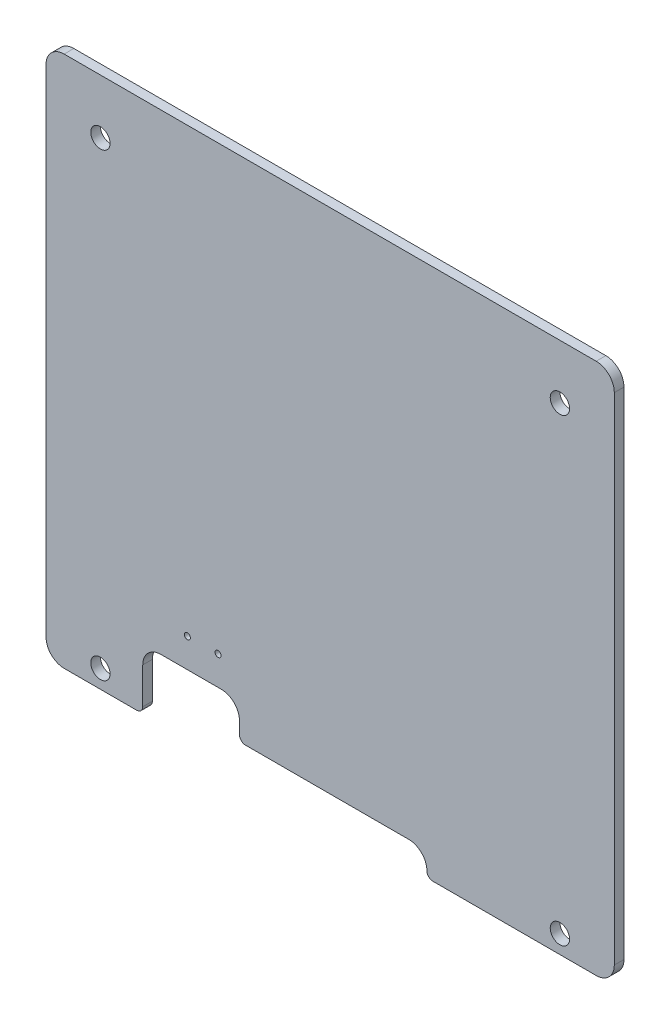
ISO-10303-21;
HEADER;
FILE_DESCRIPTION(('STEP AP214'),'2;1');
FILE_NAME('part.step','',(''),(''),'','','');
FILE_SCHEMA(('AUTOMOTIVE_DESIGN { 1 0 10303 214 1 1 1 1 }'));
ENDSEC;
DATA;
#1=APPLICATION_CONTEXT('core data for automotive mechanical design processes');
#2=APPLICATION_PROTOCOL_DEFINITION('international standard','automotive_design',2000,#1);
#3=PRODUCT_CONTEXT('',#1,'mechanical');
#4=PRODUCT('Part','Part','',(#3));
#5=PRODUCT_RELATED_PRODUCT_CATEGORY('part','',(#4));
#6=PRODUCT_DEFINITION_FORMATION('','',#4);
#7=PRODUCT_DEFINITION_CONTEXT('part definition',#1,'design');
#8=PRODUCT_DEFINITION('design','',#6,#7);
#9=PRODUCT_DEFINITION_SHAPE('','',#8);
#10=(LENGTH_UNIT() NAMED_UNIT(*) SI_UNIT(.MILLI.,.METRE.));
#11=(NAMED_UNIT(*) PLANE_ANGLE_UNIT() SI_UNIT($,.RADIAN.));
#12=(NAMED_UNIT(*) SI_UNIT($,.STERADIAN.) SOLID_ANGLE_UNIT());
#13=UNCERTAINTY_MEASURE_WITH_UNIT(LENGTH_MEASURE(1.E-05),#10,'distance_accuracy_value','');
#14=(GEOMETRIC_REPRESENTATION_CONTEXT(3) GLOBAL_UNCERTAINTY_ASSIGNED_CONTEXT((#13)) GLOBAL_UNIT_ASSIGNED_CONTEXT((#10,
#11,#12)) REPRESENTATION_CONTEXT('',''));
#15=CARTESIAN_POINT('',(0.,0.,0.));
#16=DIRECTION('',(0.,0.,1.));
#17=DIRECTION('',(1.,0.,0.));
#18=AXIS2_PLACEMENT_3D('',#15,#16,#17);
#19=CARTESIAN_POINT('',(-84.5653438799531,88.9518569300749,0.));
#20=DIRECTION('',(0.,0.,1.));
#21=DIRECTION('',(1.,0.,0.));
#22=AXIS2_PLACEMENT_3D('',#19,#20,#21);
#23=PLANE('',#22);
#24=CARTESIAN_POINT('',(-78.5653438799532,82.9518569300749,0.));
#25=DIRECTION('',(0.,0.,-1.));
#26=DIRECTION('',(-1.,0.,0.));
#27=AXIS2_PLACEMENT_3D('',#24,#25,#26);
#28=CIRCLE('',#27,1.59999999999999);
#29=CARTESIAN_POINT('',(-80.1653438799532,82.9518569300749,0.));
#30=VERTEX_POINT('',#29);
#31=EDGE_CURVE('E351',#30,#30,#28,.T.);
#32=ORIENTED_EDGE('',*,*,#31,.F.);
#33=EDGE_LOOP('',(#32));
#34=FACE_BOUND('',#33,.T.);
#35=CARTESIAN_POINT('',(-2.56534387995316,6.95185693007487,0.));
#36=DIRECTION('',(0.,0.,-1.));
#37=DIRECTION('',(-1.,0.,0.));
#38=AXIS2_PLACEMENT_3D('',#35,#36,#37);
#39=CIRCLE('',#38,1.59999999999999);
#40=CARTESIAN_POINT('',(-4.16534387995315,6.95185693007487,0.));
#41=VERTEX_POINT('',#40);
#42=EDGE_CURVE('E339',#41,#41,#39,.T.);
#43=ORIENTED_EDGE('',*,*,#42,.F.);
#44=EDGE_LOOP('',(#43));
#45=FACE_BOUND('',#44,.T.);
#46=CARTESIAN_POINT('',(-59.1053438799531,18.7518569300749,0.));
#47=DIRECTION('',(0.,0.,1.));
#48=DIRECTION('',(1.,0.,0.));
#49=AXIS2_PLACEMENT_3D('',#46,#47,#48);
#50=CIRCLE('',#49,0.500000000000006);
#51=CARTESIAN_POINT('',(-58.6053438799531,18.7518569300749,0.));
#52=VERTEX_POINT('',#51);
#53=EDGE_CURVE('E325',#52,#52,#50,.T.);
#54=ORIENTED_EDGE('',*,*,#53,.T.);
#55=EDGE_LOOP('',(#54));
#56=FACE_BOUND('',#55,.T.);
#57=DIRECTION('',(1.,0.,0.));
#58=VECTOR('',#57,1.);
#59=CARTESIAN_POINT('',(-55.5653438799532,7.9518569300749,0.));
#60=LINE('',#59,#58);
#61=CARTESIAN_POINT('',(-54.5653438799532,7.9518569300749,0.));
#62=VERTEX_POINT('',#61);
#63=CARTESIAN_POINT('',(-27.5653438799532,7.95185693007489,0.));
#64=VERTEX_POINT('',#63);
#65=EDGE_CURVE('E268',#62,#64,#60,.T.);
#66=ORIENTED_EDGE('',*,*,#65,.F.);
#67=CARTESIAN_POINT('',(-54.5653438799532,8.9518569300749,0.));
#68=DIRECTION('',(0.,0.,1.));
#69=DIRECTION('',(1.,0.,0.));
#70=AXIS2_PLACEMENT_3D('',#67,#68,#69);
#71=CIRCLE('',#70,1.);
#72=CARTESIAN_POINT('',(-55.5653438799532,8.9518569300749,0.));
#73=VERTEX_POINT('',#72);
#74=EDGE_CURVE('E231',#62,#73,#71,.F.);
#75=ORIENTED_EDGE('',*,*,#74,.T.);
#76=DIRECTION('',(0.,-1.,0.));
#77=VECTOR('',#76,1.);
#78=CARTESIAN_POINT('',(-55.5653438799532,7.9518569300749,0.));
#79=LINE('',#78,#77);
#80=CARTESIAN_POINT('',(-55.5653438799532,10.9518569300749,0.));
#81=VERTEX_POINT('',#80);
#82=EDGE_CURVE('E260',#81,#73,#79,.T.);
#83=ORIENTED_EDGE('',*,*,#82,.F.);
#84=CARTESIAN_POINT('',(-58.5653438799532,10.9518569300749,0.));
#85=DIRECTION('',(0.,0.,1.));
#86=DIRECTION('',(1.,0.,0.));
#87=AXIS2_PLACEMENT_3D('',#84,#85,#86);
#88=CIRCLE('',#87,3.);
#89=CARTESIAN_POINT('',(-58.5653438799532,13.9518569300749,0.));
#90=VERTEX_POINT('',#89);
#91=EDGE_CURVE('E215',#81,#90,#88,.T.);
#92=ORIENTED_EDGE('',*,*,#91,.T.);
#93=DIRECTION('',(1.,0.,0.));
#94=VECTOR('',#93,1.);
#95=CARTESIAN_POINT('',(-55.5653438799532,13.9518569300749,0.));
#96=LINE('',#95,#94);
#97=CARTESIAN_POINT('',(-68.5653438799531,13.9518569300749,0.));
#98=VERTEX_POINT('',#97);
#99=EDGE_CURVE('E256',#98,#90,#96,.T.);
#100=ORIENTED_EDGE('',*,*,#99,.F.);
#101=CARTESIAN_POINT('',(-68.5653438799531,10.9518569300749,0.));
#102=DIRECTION('',(0.,0.,1.));
#103=DIRECTION('',(1.,0.,0.));
#104=AXIS2_PLACEMENT_3D('',#101,#102,#103);
#105=CIRCLE('',#104,3.);
#106=CARTESIAN_POINT('',(-71.5653438799531,10.9518569300749,0.));
#107=VERTEX_POINT('',#106);
#108=EDGE_CURVE('E219',#98,#107,#105,.T.);
#109=ORIENTED_EDGE('',*,*,#108,.T.);
#110=DIRECTION('',(0.,1.,0.));
#111=VECTOR('',#110,1.);
#112=CARTESIAN_POINT('',(-71.5653438799531,13.9518569300749,0.));
#113=LINE('',#112,#111);
#114=CARTESIAN_POINT('',(-71.5653438799531,4.9518569300749,0.));
#115=VERTEX_POINT('',#114);
#116=EDGE_CURVE('E246',#115,#107,#113,.T.);
#117=ORIENTED_EDGE('',*,*,#116,.F.);
#118=CARTESIAN_POINT('',(-72.5653438799531,4.9518569300749,0.));
#119=DIRECTION('',(0.,0.,1.));
#120=DIRECTION('',(1.,0.,0.));
#121=AXIS2_PLACEMENT_3D('',#118,#119,#120);
#122=CIRCLE('',#121,1.);
#123=CARTESIAN_POINT('',(-72.5653438799531,3.9518569300749,0.));
#124=VERTEX_POINT('',#123);
#125=EDGE_CURVE('E227',#115,#124,#122,.F.);
#126=ORIENTED_EDGE('',*,*,#125,.T.);
#127=DIRECTION('',(1.,0.,0.));
#128=VECTOR('',#127,1.);
#129=CARTESIAN_POINT('',(-84.5653438799531,3.9518569300749,0.));
#130=LINE('',#129,#128);
#131=CARTESIAN_POINT('',(-84.5653438799531,3.9518569300749,0.));
#132=VERTEX_POINT('',#131);
#133=EDGE_CURVE('E257',#132,#124,#130,.T.);
#134=ORIENTED_EDGE('',*,*,#133,.F.);
#135=CARTESIAN_POINT('',(-84.5653438799531,6.9518569300749,0.));
#136=DIRECTION('',(0.,0.,1.));
#137=DIRECTION('',(-1.,0.,0.));
#138=AXIS2_PLACEMENT_3D('',#135,#136,#137);
#139=CIRCLE('',#138,3.);
#140=CARTESIAN_POINT('',(-87.5653438799531,6.95185693007492,0.));
#141=VERTEX_POINT('',#140);
#142=EDGE_CURVE('E262',#141,#132,#139,.T.);
#143=ORIENTED_EDGE('',*,*,#142,.F.);
#144=DIRECTION('',(0.,-1.,0.));
#145=VECTOR('',#144,1.);
#146=CARTESIAN_POINT('',(-87.5653438799531,88.9518569300748,0.));
#147=LINE('',#146,#145);
#148=CARTESIAN_POINT('',(-87.5653438799531,88.9518569300748,0.));
#149=VERTEX_POINT('',#148);
#150=EDGE_CURVE('E301',#149,#141,#147,.T.);
#151=ORIENTED_EDGE('',*,*,#150,.F.);
#152=CARTESIAN_POINT('',(-84.5653438799531,88.9518569300749,0.));
#153=DIRECTION('',(0.,0.,1.));
#154=DIRECTION('',(1.,0.,0.));
#155=AXIS2_PLACEMENT_3D('',#152,#153,#154);
#156=CIRCLE('',#155,3.);
#157=CARTESIAN_POINT('',(-84.5653438799531,91.9518569300749,0.));
#158=VERTEX_POINT('',#157);
#159=EDGE_CURVE('E187',#158,#149,#156,.T.);
#160=ORIENTED_EDGE('',*,*,#159,.F.);
#161=DIRECTION('',(-1.,0.,0.));
#162=VECTOR('',#161,1.);
#163=CARTESIAN_POINT('',(-84.5653438799531,91.9518569300749,0.));
#164=LINE('',#163,#162);
#165=CARTESIAN_POINT('',(3.43465612004681,91.9518569300749,0.));
#166=VERTEX_POINT('',#165);
#167=EDGE_CURVE('E183',#166,#158,#164,.T.);
#168=ORIENTED_EDGE('',*,*,#167,.F.);
#169=CARTESIAN_POINT('',(3.43465612004683,88.9518569300749,0.));
#170=DIRECTION('',(0.,0.,1.));
#171=DIRECTION('',(-1.,0.,0.));
#172=AXIS2_PLACEMENT_3D('',#169,#170,#171);
#173=CIRCLE('',#172,3.);
#174=CARTESIAN_POINT('',(6.43465612004683,88.9518569300748,0.));
#175=VERTEX_POINT('',#174);
#176=EDGE_CURVE('E276',#175,#166,#173,.T.);
#177=ORIENTED_EDGE('',*,*,#176,.F.);
#178=DIRECTION('',(0.,1.,0.));
#179=VECTOR('',#178,1.);
#180=CARTESIAN_POINT('',(6.43465612004683,88.9518569300748,0.));
#181=LINE('',#180,#179);
#182=CARTESIAN_POINT('',(6.43465612004684,6.9518569300749,0.));
#183=VERTEX_POINT('',#182);
#184=EDGE_CURVE('E274',#183,#175,#181,.T.);
#185=ORIENTED_EDGE('',*,*,#184,.F.);
#186=CARTESIAN_POINT('',(3.43465612004684,6.9518569300749,0.));
#187=DIRECTION('',(0.,0.,1.));
#188=DIRECTION('',(1.,0.,0.));
#189=AXIS2_PLACEMENT_3D('',#186,#187,#188);
#190=CIRCLE('',#189,3.);
#191=CARTESIAN_POINT('',(3.43465612004684,3.9518569300749,0.));
#192=VERTEX_POINT('',#191);
#193=EDGE_CURVE('E272',#192,#183,#190,.T.);
#194=ORIENTED_EDGE('',*,*,#193,.F.);
#195=DIRECTION('',(1.,0.,0.));
#196=VECTOR('',#195,1.);
#197=CARTESIAN_POINT('',(-24.5653438799532,3.95185693007489,0.));
#198=LINE('',#197,#196);
#199=CARTESIAN_POINT('',(-23.5653438799532,3.95185693007489,0.));
#200=VERTEX_POINT('',#199);
#201=EDGE_CURVE('E270',#200,#192,#198,.T.);
#202=ORIENTED_EDGE('',*,*,#201,.F.);
#203=CARTESIAN_POINT('',(-23.5653438799532,4.95185693007489,0.));
#204=DIRECTION('',(0.,0.,1.));
#205=DIRECTION('',(1.,0.,0.));
#206=AXIS2_PLACEMENT_3D('',#203,#204,#205);
#207=CIRCLE('',#206,1.);
#208=CARTESIAN_POINT('',(-24.5653438799532,4.95185693007489,0.));
#209=VERTEX_POINT('',#208);
#210=EDGE_CURVE('E229',#200,#209,#207,.F.);
#211=ORIENTED_EDGE('',*,*,#210,.T.);
#212=CARTESIAN_POINT('',(-27.5653438799532,4.95185693007489,0.));
#213=DIRECTION('',(0.,0.,1.));
#214=DIRECTION('',(1.,0.,0.));
#215=AXIS2_PLACEMENT_3D('',#212,#213,#214);
#216=CIRCLE('',#215,3.);
#217=EDGE_CURVE('E210',#209,#64,#216,.T.);
#218=ORIENTED_EDGE('',*,*,#217,.T.);
#219=EDGE_LOOP('',(#66,#75,#83,#92,#100,#109,#117,#126,#134,#143,#151,#160,#168,#177,#185,#194,
#202,#211,#218));
#220=FACE_BOUND('',#219,.T.);
#221=CARTESIAN_POINT('',(-64.1853438799531,18.7518569300749,0.));
#222=DIRECTION('',(0.,0.,1.));
#223=DIRECTION('',(1.,0.,0.));
#224=AXIS2_PLACEMENT_3D('',#221,#222,#223);
#225=CIRCLE('',#224,0.499999999999999);
#226=CARTESIAN_POINT('',(-63.6853438799531,18.7518569300749,0.));
#227=VERTEX_POINT('',#226);
#228=EDGE_CURVE('E331',#227,#227,#225,.T.);
#229=ORIENTED_EDGE('',*,*,#228,.T.);
#230=EDGE_LOOP('',(#229));
#231=FACE_BOUND('',#230,.T.);
#232=CARTESIAN_POINT('',(-2.56534387995318,82.9518569300749,0.));
#233=DIRECTION('',(0.,0.,-1.));
#234=DIRECTION('',(-1.,0.,0.));
#235=AXIS2_PLACEMENT_3D('',#232,#233,#234);
#236=CIRCLE('',#235,1.59999999999999);
#237=CARTESIAN_POINT('',(-4.16534387995317,82.9518569300749,0.));
#238=VERTEX_POINT('',#237);
#239=EDGE_CURVE('E345',#238,#238,#236,.T.);
#240=ORIENTED_EDGE('',*,*,#239,.F.);
#241=EDGE_LOOP('',(#240));
#242=FACE_BOUND('',#241,.T.);
#243=CARTESIAN_POINT('',(-78.5653438799531,6.95185693007482,0.));
#244=DIRECTION('',(0.,0.,-1.));
#245=DIRECTION('',(-1.,0.,0.));
#246=AXIS2_PLACEMENT_3D('',#243,#244,#245);
#247=CIRCLE('',#246,1.59999999999999);
#248=CARTESIAN_POINT('',(-80.1653438799531,6.95185693007482,0.));
#249=VERTEX_POINT('',#248);
#250=EDGE_CURVE('E357',#249,#249,#247,.T.);
#251=ORIENTED_EDGE('',*,*,#250,.F.);
#252=EDGE_LOOP('',(#251));
#253=FACE_BOUND('',#252,.T.);
#254=ADVANCED_FACE('F32',(#34,#45,#56,#220,#231,#242,#253),#23,.F.);
#255=CARTESIAN_POINT('',(-84.5653438799531,88.9518569300749,1.6));
#256=DIRECTION('',(0.,0.,1.));
#257=DIRECTION('',(1.,0.,0.));
#258=AXIS2_PLACEMENT_3D('',#255,#256,#257);
#259=PLANE('',#258);
#260=CARTESIAN_POINT('',(-78.5653438799531,6.95185693007482,1.6));
#261=DIRECTION('',(0.,0.,1.));
#262=DIRECTION('',(1.,0.,0.));
#263=AXIS2_PLACEMENT_3D('',#260,#261,#262);
#264=CIRCLE('',#263,1.6);
#265=CARTESIAN_POINT('',(-76.9653438799532,6.95185693007482,1.6));
#266=VERTEX_POINT('',#265);
#267=EDGE_CURVE('E354',#266,#266,#264,.T.);
#268=ORIENTED_EDGE('',*,*,#267,.F.);
#269=EDGE_LOOP('',(#268));
#270=FACE_BOUND('',#269,.T.);
#271=CARTESIAN_POINT('',(-78.5653438799532,82.9518569300749,1.6));
#272=DIRECTION('',(0.,0.,1.));
#273=DIRECTION('',(1.,0.,0.));
#274=AXIS2_PLACEMENT_3D('',#271,#272,#273);
#275=CIRCLE('',#274,1.6);
#276=CARTESIAN_POINT('',(-76.9653438799532,82.9518569300749,1.6));
#277=VERTEX_POINT('',#276);
#278=EDGE_CURVE('E348',#277,#277,#275,.T.);
#279=ORIENTED_EDGE('',*,*,#278,.F.);
#280=EDGE_LOOP('',(#279));
#281=FACE_BOUND('',#280,.T.);
#282=CARTESIAN_POINT('',(-2.56534387995318,82.9518569300749,1.6));
#283=DIRECTION('',(0.,0.,1.));
#284=DIRECTION('',(1.,0.,0.));
#285=AXIS2_PLACEMENT_3D('',#282,#283,#284);
#286=CIRCLE('',#285,1.59999999999999);
#287=CARTESIAN_POINT('',(-0.965343879953191,82.9518569300749,1.6));
#288=VERTEX_POINT('',#287);
#289=EDGE_CURVE('E342',#288,#288,#286,.T.);
#290=ORIENTED_EDGE('',*,*,#289,.F.);
#291=EDGE_LOOP('',(#290));
#292=FACE_BOUND('',#291,.T.);
#293=CARTESIAN_POINT('',(-2.56534387995316,6.95185693007487,1.6));
#294=DIRECTION('',(0.,0.,1.));
#295=DIRECTION('',(1.,0.,0.));
#296=AXIS2_PLACEMENT_3D('',#293,#294,#295);
#297=CIRCLE('',#296,1.59999999999999);
#298=CARTESIAN_POINT('',(-0.96534387995317,6.95185693007487,1.6));
#299=VERTEX_POINT('',#298);
#300=EDGE_CURVE('E334',#299,#299,#297,.T.);
#301=ORIENTED_EDGE('',*,*,#300,.F.);
#302=EDGE_LOOP('',(#301));
#303=FACE_BOUND('',#302,.T.);
#304=CARTESIAN_POINT('',(-59.1053438799531,18.7518569300749,1.6));
#305=DIRECTION('',(0.,0.,1.));
#306=DIRECTION('',(1.,0.,0.));
#307=AXIS2_PLACEMENT_3D('',#304,#305,#306);
#308=CIRCLE('',#307,0.500000000000006);
#309=CARTESIAN_POINT('',(-58.6053438799531,18.7518569300749,1.6));
#310=VERTEX_POINT('',#309);
#311=EDGE_CURVE('E305',#310,#310,#308,.T.);
#312=ORIENTED_EDGE('',*,*,#311,.F.);
#313=EDGE_LOOP('',(#312));
#314=FACE_BOUND('',#313,.T.);
#315=DIRECTION('',(0.,-1.,0.));
#316=VECTOR('',#315,1.);
#317=CARTESIAN_POINT('',(-55.5653438799532,7.9518569300749,1.6));
#318=LINE('',#317,#316);
#319=CARTESIAN_POINT('',(-55.5653438799532,10.9518569300749,1.6));
#320=VERTEX_POINT('',#319);
#321=CARTESIAN_POINT('',(-55.5653438799532,8.9518569300749,1.6));
#322=VERTEX_POINT('',#321);
#323=EDGE_CURVE('E317',#320,#322,#318,.T.);
#324=ORIENTED_EDGE('',*,*,#323,.T.);
#325=CARTESIAN_POINT('',(-54.5653438799532,8.9518569300749,1.6));
#326=DIRECTION('',(0.,0.,1.));
#327=DIRECTION('',(1.,0.,0.));
#328=AXIS2_PLACEMENT_3D('',#325,#326,#327);
#329=CIRCLE('',#328,1.);
#330=CARTESIAN_POINT('',(-54.5653438799532,7.9518569300749,1.6));
#331=VERTEX_POINT('',#330);
#332=EDGE_CURVE('E237',#322,#331,#329,.T.);
#333=ORIENTED_EDGE('',*,*,#332,.T.);
#334=DIRECTION('',(1.,0.,0.));
#335=VECTOR('',#334,1.);
#336=CARTESIAN_POINT('',(-55.5653438799532,7.9518569300749,1.6));
#337=LINE('',#336,#335);
#338=CARTESIAN_POINT('',(-27.5653438799532,7.95185693007489,1.6));
#339=VERTEX_POINT('',#338);
#340=EDGE_CURVE('E315',#331,#339,#337,.T.);
#341=ORIENTED_EDGE('',*,*,#340,.T.);
#342=CARTESIAN_POINT('',(-27.5653438799532,4.95185693007489,1.6));
#343=DIRECTION('',(0.,0.,1.));
#344=DIRECTION('',(1.,0.,0.));
#345=AXIS2_PLACEMENT_3D('',#342,#343,#344);
#346=CIRCLE('',#345,3.);
#347=CARTESIAN_POINT('',(-24.5653438799532,4.95185693007489,1.6));
#348=VERTEX_POINT('',#347);
#349=EDGE_CURVE('E213',#339,#348,#346,.F.);
#350=ORIENTED_EDGE('',*,*,#349,.T.);
#351=CARTESIAN_POINT('',(-23.5653438799532,4.95185693007489,1.6));
#352=DIRECTION('',(0.,0.,1.));
#353=DIRECTION('',(1.,0.,0.));
#354=AXIS2_PLACEMENT_3D('',#351,#352,#353);
#355=CIRCLE('',#354,1.);
#356=CARTESIAN_POINT('',(-23.5653438799532,3.95185693007489,1.6));
#357=VERTEX_POINT('',#356);
#358=EDGE_CURVE('E47',#348,#357,#355,.T.);
#359=ORIENTED_EDGE('',*,*,#358,.T.);
#360=DIRECTION('',(1.,0.,0.));
#361=VECTOR('',#360,1.);
#362=CARTESIAN_POINT('',(-24.5653438799532,3.95185693007489,1.6));
#363=LINE('',#362,#361);
#364=CARTESIAN_POINT('',(3.43465612004684,3.9518569300749,1.6));
#365=VERTEX_POINT('',#364);
#366=EDGE_CURVE('E313',#357,#365,#363,.T.);
#367=ORIENTED_EDGE('',*,*,#366,.T.);
#368=CARTESIAN_POINT('',(3.43465612004684,6.9518569300749,1.6));
#369=DIRECTION('',(0.,0.,1.));
#370=DIRECTION('',(1.,0.,0.));
#371=AXIS2_PLACEMENT_3D('',#368,#369,#370);
#372=CIRCLE('',#371,3.);
#373=CARTESIAN_POINT('',(6.43465612004684,6.9518569300749,1.6));
#374=VERTEX_POINT('',#373);
#375=EDGE_CURVE('E311',#365,#374,#372,.T.);
#376=ORIENTED_EDGE('',*,*,#375,.T.);
#377=DIRECTION('',(0.,1.,0.));
#378=VECTOR('',#377,1.);
#379=CARTESIAN_POINT('',(6.43465612004683,88.9518569300748,1.6));
#380=LINE('',#379,#378);
#381=CARTESIAN_POINT('',(6.43465612004683,88.9518569300748,1.6));
#382=VERTEX_POINT('',#381);
#383=EDGE_CURVE('E309',#374,#382,#380,.T.);
#384=ORIENTED_EDGE('',*,*,#383,.T.);
#385=CARTESIAN_POINT('',(3.43465612004683,88.9518569300749,1.6));
#386=DIRECTION('',(0.,0.,1.));
#387=DIRECTION('',(-1.,0.,0.));
#388=AXIS2_PLACEMENT_3D('',#385,#386,#387);
#389=CIRCLE('',#388,3.);
#390=CARTESIAN_POINT('',(3.43465612004681,91.9518569300749,1.6));
#391=VERTEX_POINT('',#390);
#392=EDGE_CURVE('E307',#382,#391,#389,.T.);
#393=ORIENTED_EDGE('',*,*,#392,.T.);
#394=DIRECTION('',(-1.,0.,0.));
#395=VECTOR('',#394,1.);
#396=CARTESIAN_POINT('',(-84.5653438799531,91.9518569300749,1.6));
#397=LINE('',#396,#395);
#398=CARTESIAN_POINT('',(-84.5653438799531,91.9518569300749,1.6));
#399=VERTEX_POINT('',#398);
#400=EDGE_CURVE('E179',#391,#399,#397,.T.);
#401=ORIENTED_EDGE('',*,*,#400,.T.);
#402=CARTESIAN_POINT('',(-84.5653438799531,88.9518569300749,1.6));
#403=DIRECTION('',(0.,0.,1.));
#404=DIRECTION('',(1.,0.,0.));
#405=AXIS2_PLACEMENT_3D('',#402,#403,#404);
#406=CIRCLE('',#405,3.);
#407=CARTESIAN_POINT('',(-87.5653438799531,88.9518569300748,1.6));
#408=VERTEX_POINT('',#407);
#409=EDGE_CURVE('E172',#399,#408,#406,.T.);
#410=ORIENTED_EDGE('',*,*,#409,.T.);
#411=DIRECTION('',(0.,-1.,0.));
#412=VECTOR('',#411,1.);
#413=CARTESIAN_POINT('',(-87.5653438799531,88.9518569300748,1.6));
#414=LINE('',#413,#412);
#415=CARTESIAN_POINT('',(-87.5653438799531,6.95185693007492,1.6));
#416=VERTEX_POINT('',#415);
#417=EDGE_CURVE('E162',#408,#416,#414,.T.);
#418=ORIENTED_EDGE('',*,*,#417,.T.);
#419=CARTESIAN_POINT('',(-84.5653438799531,6.9518569300749,1.6));
#420=DIRECTION('',(0.,0.,1.));
#421=DIRECTION('',(-1.,0.,0.));
#422=AXIS2_PLACEMENT_3D('',#419,#420,#421);
#423=CIRCLE('',#422,3.);
#424=CARTESIAN_POINT('',(-84.5653438799531,3.9518569300749,1.6));
#425=VERTEX_POINT('',#424);
#426=EDGE_CURVE('E171',#416,#425,#423,.T.);
#427=ORIENTED_EDGE('',*,*,#426,.T.);
#428=DIRECTION('',(1.,0.,0.));
#429=VECTOR('',#428,1.);
#430=CARTESIAN_POINT('',(-84.5653438799531,3.9518569300749,1.6));
#431=LINE('',#430,#429);
#432=CARTESIAN_POINT('',(-72.5653438799531,3.9518569300749,1.6));
#433=VERTEX_POINT('',#432);
#434=EDGE_CURVE('E298',#425,#433,#431,.T.);
#435=ORIENTED_EDGE('',*,*,#434,.T.);
#436=CARTESIAN_POINT('',(-72.5653438799531,4.9518569300749,1.6));
#437=DIRECTION('',(0.,0.,1.));
#438=DIRECTION('',(1.,0.,0.));
#439=AXIS2_PLACEMENT_3D('',#436,#437,#438);
#440=CIRCLE('',#439,1.);
#441=CARTESIAN_POINT('',(-71.5653438799531,4.9518569300749,1.6));
#442=VERTEX_POINT('',#441);
#443=EDGE_CURVE('E54',#433,#442,#440,.T.);
#444=ORIENTED_EDGE('',*,*,#443,.T.);
#445=DIRECTION('',(0.,1.,0.));
#446=VECTOR('',#445,1.);
#447=CARTESIAN_POINT('',(-71.5653438799531,13.9518569300749,1.6));
#448=LINE('',#447,#446);
#449=CARTESIAN_POINT('',(-71.5653438799531,10.9518569300749,1.6));
#450=VERTEX_POINT('',#449);
#451=EDGE_CURVE('E247',#442,#450,#448,.T.);
#452=ORIENTED_EDGE('',*,*,#451,.T.);
#453=CARTESIAN_POINT('',(-68.5653438799531,10.9518569300749,1.6));
#454=DIRECTION('',(0.,0.,1.));
#455=DIRECTION('',(1.,0.,0.));
#456=AXIS2_PLACEMENT_3D('',#453,#454,#455);
#457=CIRCLE('',#456,3.);
#458=CARTESIAN_POINT('',(-68.5653438799531,13.9518569300749,1.6));
#459=VERTEX_POINT('',#458);
#460=EDGE_CURVE('E222',#450,#459,#457,.F.);
#461=ORIENTED_EDGE('',*,*,#460,.T.);
#462=DIRECTION('',(1.,0.,0.));
#463=VECTOR('',#462,1.);
#464=CARTESIAN_POINT('',(-55.5653438799532,13.9518569300749,1.6));
#465=LINE('',#464,#463);
#466=CARTESIAN_POINT('',(-58.5653438799532,13.9518569300749,1.6));
#467=VERTEX_POINT('',#466);
#468=EDGE_CURVE('E319',#459,#467,#465,.T.);
#469=ORIENTED_EDGE('',*,*,#468,.T.);
#470=CARTESIAN_POINT('',(-58.5653438799532,10.9518569300749,1.6));
#471=DIRECTION('',(0.,0.,1.));
#472=DIRECTION('',(1.,0.,0.));
#473=AXIS2_PLACEMENT_3D('',#470,#471,#472);
#474=CIRCLE('',#473,3.);
#475=EDGE_CURVE('E217',#467,#320,#474,.F.);
#476=ORIENTED_EDGE('',*,*,#475,.T.);
#477=EDGE_LOOP('',(#324,#333,#341,#350,#359,#367,#376,#384,#393,#401,#410,#418,#427,#435,#444,
#452,#461,#469,#476));
#478=FACE_BOUND('',#477,.T.);
#479=CARTESIAN_POINT('',(-64.1853438799531,18.7518569300749,1.6));
#480=DIRECTION('',(0.,0.,1.));
#481=DIRECTION('',(1.,0.,0.));
#482=AXIS2_PLACEMENT_3D('',#479,#480,#481);
#483=CIRCLE('',#482,0.499999999999999);
#484=CARTESIAN_POINT('',(-63.6853438799531,18.7518569300749,1.6));
#485=VERTEX_POINT('',#484);
#486=EDGE_CURVE('E328',#485,#485,#483,.T.);
#487=ORIENTED_EDGE('',*,*,#486,.F.);
#488=EDGE_LOOP('',(#487));
#489=FACE_BOUND('',#488,.T.);
#490=ADVANCED_FACE('F176',(#270,#281,#292,#303,#314,#478,#489),#259,.T.);
#491=CARTESIAN_POINT('',(-84.5653438799531,88.9518569300749,1.6));
#492=DIRECTION('',(0.,0.,-1.));
#493=DIRECTION('',(-1.,0.,0.));
#494=AXIS2_PLACEMENT_3D('',#491,#492,#493);
#495=CYLINDRICAL_SURFACE('',#494,3.);
#496=ORIENTED_EDGE('',*,*,#159,.T.);
#497=DIRECTION('',(0.,0.,-1.));
#498=VECTOR('',#497,1.);
#499=CARTESIAN_POINT('',(-87.5653438799531,88.9518569300748,1.6));
#500=LINE('',#499,#498);
#501=EDGE_CURVE('E166',#408,#149,#500,.T.);
#502=ORIENTED_EDGE('',*,*,#501,.F.);
#503=ORIENTED_EDGE('',*,*,#409,.F.);
#504=DIRECTION('',(0.,0.,-1.));
#505=VECTOR('',#504,1.);
#506=CARTESIAN_POINT('',(-84.5653438799531,91.9518569300749,1.6));
#507=LINE('',#506,#505);
#508=EDGE_CURVE('E279',#399,#158,#507,.T.);
#509=ORIENTED_EDGE('',*,*,#508,.T.);
#510=EDGE_LOOP('',(#496,#502,#503,#509));
#511=FACE_BOUND('',#510,.T.);
#512=ADVANCED_FACE('F185',(#511),#495,.T.);
#513=CARTESIAN_POINT('',(-87.5653438799531,88.9518569300748,1.6));
#514=DIRECTION('',(1.,0.,0.));
#515=DIRECTION('',(0.,0.,-1.));
#516=AXIS2_PLACEMENT_3D('',#513,#514,#515);
#517=PLANE('',#516);
#518=ORIENTED_EDGE('',*,*,#150,.T.);
#519=DIRECTION('',(0.,0.,-1.));
#520=VECTOR('',#519,1.);
#521=CARTESIAN_POINT('',(-87.5653438799531,6.95185693007492,1.6));
#522=LINE('',#521,#520);
#523=EDGE_CURVE('E169',#416,#141,#522,.T.);
#524=ORIENTED_EDGE('',*,*,#523,.F.);
#525=ORIENTED_EDGE('',*,*,#417,.F.);
#526=ORIENTED_EDGE('',*,*,#501,.T.);
#527=EDGE_LOOP('',(#518,#524,#525,#526));
#528=FACE_BOUND('',#527,.T.);
#529=ADVANCED_FACE('F164',(#528),#517,.F.);
#530=CARTESIAN_POINT('',(-84.5653438799531,6.9518569300749,1.6));
#531=DIRECTION('',(0.,0.,-1.));
#532=DIRECTION('',(-1.,0.,0.));
#533=AXIS2_PLACEMENT_3D('',#530,#531,#532);
#534=CYLINDRICAL_SURFACE('',#533,3.);
#535=ORIENTED_EDGE('',*,*,#142,.T.);
#536=DIRECTION('',(0.,0.,-1.));
#537=VECTOR('',#536,1.);
#538=CARTESIAN_POINT('',(-84.5653438799531,3.9518569300749,1.6));
#539=LINE('',#538,#537);
#540=EDGE_CURVE('E193',#425,#132,#539,.T.);
#541=ORIENTED_EDGE('',*,*,#540,.F.);
#542=ORIENTED_EDGE('',*,*,#426,.F.);
#543=ORIENTED_EDGE('',*,*,#523,.T.);
#544=EDGE_LOOP('',(#535,#541,#542,#543));
#545=FACE_BOUND('',#544,.T.);
#546=ADVANCED_FACE('F413',(#545),#534,.T.);
#547=CARTESIAN_POINT('',(-84.5653438799531,3.9518569300749,1.6));
#548=DIRECTION('',(0.,1.,0.));
#549=DIRECTION('',(-1.,0.,0.));
#550=AXIS2_PLACEMENT_3D('',#547,#548,#549);
#551=PLANE('',#550);
#552=ORIENTED_EDGE('',*,*,#133,.T.);
#553=DIRECTION('',(0.,0.,-1.));
#554=VECTOR('',#553,1.);
#555=CARTESIAN_POINT('',(-72.5653438799531,3.9518569300749,1.6));
#556=LINE('',#555,#554);
#557=EDGE_CURVE('E11',#124,#433,#556,.F.);
#558=ORIENTED_EDGE('',*,*,#557,.T.);
#559=ORIENTED_EDGE('',*,*,#434,.F.);
#560=ORIENTED_EDGE('',*,*,#540,.T.);
#561=EDGE_LOOP('',(#552,#558,#559,#560));
#562=FACE_BOUND('',#561,.T.);
#563=ADVANCED_FACE('F296',(#562),#551,.F.);
#564=CARTESIAN_POINT('',(-71.5653438799531,13.9518569300749,1.6));
#565=DIRECTION('',(-1.,0.,0.));
#566=DIRECTION('',(0.,0.,1.));
#567=AXIS2_PLACEMENT_3D('',#564,#565,#566);
#568=PLANE('',#567);
#569=ORIENTED_EDGE('',*,*,#451,.F.);
#570=DIRECTION('',(0.,0.,-1.));
#571=VECTOR('',#570,1.);
#572=CARTESIAN_POINT('',(-71.5653438799531,4.9518569300749,1.6));
#573=LINE('',#572,#571);
#574=EDGE_CURVE('E40',#442,#115,#573,.T.);
#575=ORIENTED_EDGE('',*,*,#574,.T.);
#576=ORIENTED_EDGE('',*,*,#116,.T.);
#577=DIRECTION('',(0.,0.,-1.));
#578=VECTOR('',#577,1.);
#579=CARTESIAN_POINT('',(-71.5653438799531,10.9518569300749,1.6));
#580=LINE('',#579,#578);
#581=EDGE_CURVE('E207',#107,#450,#580,.F.);
#582=ORIENTED_EDGE('',*,*,#581,.T.);
#583=EDGE_LOOP('',(#569,#575,#576,#582));
#584=FACE_BOUND('',#583,.T.);
#585=ADVANCED_FACE('F245',(#584),#568,.F.);
#586=CARTESIAN_POINT('',(-55.5653438799532,13.9518569300749,1.6));
#587=DIRECTION('',(0.,1.,0.));
#588=DIRECTION('',(-1.,0.,0.));
#589=AXIS2_PLACEMENT_3D('',#586,#587,#588);
#590=PLANE('',#589);
#591=ORIENTED_EDGE('',*,*,#99,.T.);
#592=DIRECTION('',(0.,0.,-1.));
#593=VECTOR('',#592,1.);
#594=CARTESIAN_POINT('',(-58.5653438799532,13.9518569300749,1.6));
#595=LINE('',#594,#593);
#596=EDGE_CURVE('E205',#90,#467,#595,.F.);
#597=ORIENTED_EDGE('',*,*,#596,.T.);
#598=ORIENTED_EDGE('',*,*,#468,.F.);
#599=DIRECTION('',(0.,0.,-1.));
#600=VECTOR('',#599,1.);
#601=CARTESIAN_POINT('',(-68.5653438799531,13.9518569300749,0.));
#602=LINE('',#601,#600);
#603=EDGE_CURVE('E202',#459,#98,#602,.T.);
#604=ORIENTED_EDGE('',*,*,#603,.T.);
#605=EDGE_LOOP('',(#591,#597,#598,#604));
#606=FACE_BOUND('',#605,.T.);
#607=ADVANCED_FACE('F404',(#606),#590,.F.);
#608=CARTESIAN_POINT('',(-55.5653438799532,7.9518569300749,1.6));
#609=DIRECTION('',(1.,0.,0.));
#610=DIRECTION('',(0.,0.,-1.));
#611=AXIS2_PLACEMENT_3D('',#608,#609,#610);
#612=PLANE('',#611);
#613=ORIENTED_EDGE('',*,*,#82,.T.);
#614=DIRECTION('',(0.,0.,-1.));
#615=VECTOR('',#614,1.);
#616=CARTESIAN_POINT('',(-55.5653438799532,8.9518569300749,1.6));
#617=LINE('',#616,#615);
#618=EDGE_CURVE('E233',#73,#322,#617,.F.);
#619=ORIENTED_EDGE('',*,*,#618,.T.);
#620=ORIENTED_EDGE('',*,*,#323,.F.);
#621=DIRECTION('',(0.,0.,-1.));
#622=VECTOR('',#621,1.);
#623=CARTESIAN_POINT('',(-55.5653438799532,10.9518569300749,0.));
#624=LINE('',#623,#622);
#625=EDGE_CURVE('E199',#320,#81,#624,.T.);
#626=ORIENTED_EDGE('',*,*,#625,.T.);
#627=EDGE_LOOP('',(#613,#619,#620,#626));
#628=FACE_BOUND('',#627,.T.);
#629=ADVANCED_FACE('F400',(#628),#612,.F.);
#630=CARTESIAN_POINT('',(-55.5653438799532,7.9518569300749,1.6));
#631=DIRECTION('',(0.,1.,0.));
#632=DIRECTION('',(-1.,0.,0.));
#633=AXIS2_PLACEMENT_3D('',#630,#631,#632);
#634=PLANE('',#633);
#635=ORIENTED_EDGE('',*,*,#340,.F.);
#636=DIRECTION('',(0.,0.,-1.));
#637=VECTOR('',#636,1.);
#638=CARTESIAN_POINT('',(-54.5653438799532,7.9518569300749,1.6));
#639=LINE('',#638,#637);
#640=EDGE_CURVE('E224',#331,#62,#639,.T.);
#641=ORIENTED_EDGE('',*,*,#640,.T.);
#642=ORIENTED_EDGE('',*,*,#65,.T.);
#643=DIRECTION('',(0.,0.,-1.));
#644=VECTOR('',#643,1.);
#645=CARTESIAN_POINT('',(-27.5653438799532,7.95185693007489,1.6));
#646=LINE('',#645,#644);
#647=EDGE_CURVE('E191',#64,#339,#646,.F.);
#648=ORIENTED_EDGE('',*,*,#647,.T.);
#649=EDGE_LOOP('',(#635,#641,#642,#648));
#650=FACE_BOUND('',#649,.T.);
#651=ADVANCED_FACE('F396',(#650),#634,.F.);
#652=CARTESIAN_POINT('',(-24.5653438799532,3.95185693007489,1.6));
#653=DIRECTION('',(0.,1.,0.));
#654=DIRECTION('',(-1.,0.,0.));
#655=AXIS2_PLACEMENT_3D('',#652,#653,#654);
#656=PLANE('',#655);
#657=ORIENTED_EDGE('',*,*,#366,.F.);
#658=DIRECTION('',(0.,0.,-1.));
#659=VECTOR('',#658,1.);
#660=CARTESIAN_POINT('',(-23.5653438799532,3.95185693007489,1.6));
#661=LINE('',#660,#659);
#662=EDGE_CURVE('E239',#357,#200,#661,.T.);
#663=ORIENTED_EDGE('',*,*,#662,.T.);
#664=ORIENTED_EDGE('',*,*,#201,.T.);
#665=DIRECTION('',(0.,0.,-1.));
#666=VECTOR('',#665,1.);
#667=CARTESIAN_POINT('',(3.43465612004684,3.9518569300749,1.6));
#668=LINE('',#667,#666);
#669=EDGE_CURVE('E290',#365,#192,#668,.T.);
#670=ORIENTED_EDGE('',*,*,#669,.F.);
#671=EDGE_LOOP('',(#657,#663,#664,#670));
#672=FACE_BOUND('',#671,.T.);
#673=ADVANCED_FACE('F392',(#672),#656,.F.);
#674=CARTESIAN_POINT('',(3.43465612004684,6.9518569300749,1.6));
#675=DIRECTION('',(0.,0.,-1.));
#676=DIRECTION('',(-1.,0.,0.));
#677=AXIS2_PLACEMENT_3D('',#674,#675,#676);
#678=CYLINDRICAL_SURFACE('',#677,3.);
#679=ORIENTED_EDGE('',*,*,#193,.T.);
#680=DIRECTION('',(0.,0.,-1.));
#681=VECTOR('',#680,1.);
#682=CARTESIAN_POINT('',(6.43465612004684,6.9518569300749,1.6));
#683=LINE('',#682,#681);
#684=EDGE_CURVE('E287',#374,#183,#683,.T.);
#685=ORIENTED_EDGE('',*,*,#684,.F.);
#686=ORIENTED_EDGE('',*,*,#375,.F.);
#687=ORIENTED_EDGE('',*,*,#669,.T.);
#688=EDGE_LOOP('',(#679,#685,#686,#687));
#689=FACE_BOUND('',#688,.T.);
#690=ADVANCED_FACE('F388',(#689),#678,.T.);
#691=CARTESIAN_POINT('',(6.43465612004683,88.9518569300748,1.6));
#692=DIRECTION('',(-1.,0.,0.));
#693=DIRECTION('',(0.,-1.,0.));
#694=AXIS2_PLACEMENT_3D('',#691,#692,#693);
#695=PLANE('',#694);
#696=ORIENTED_EDGE('',*,*,#184,.T.);
#697=DIRECTION('',(0.,0.,-1.));
#698=VECTOR('',#697,1.);
#699=CARTESIAN_POINT('',(6.43465612004683,88.9518569300748,1.6));
#700=LINE('',#699,#698);
#701=EDGE_CURVE('E284',#382,#175,#700,.T.);
#702=ORIENTED_EDGE('',*,*,#701,.F.);
#703=ORIENTED_EDGE('',*,*,#383,.F.);
#704=ORIENTED_EDGE('',*,*,#684,.T.);
#705=EDGE_LOOP('',(#696,#702,#703,#704));
#706=FACE_BOUND('',#705,.T.);
#707=ADVANCED_FACE('F384',(#706),#695,.F.);
#708=CARTESIAN_POINT('',(3.43465612004683,88.9518569300749,1.6));
#709=DIRECTION('',(0.,0.,-1.));
#710=DIRECTION('',(-1.,0.,0.));
#711=AXIS2_PLACEMENT_3D('',#708,#709,#710);
#712=CYLINDRICAL_SURFACE('',#711,3.);
#713=ORIENTED_EDGE('',*,*,#176,.T.);
#714=DIRECTION('',(0.,0.,-1.));
#715=VECTOR('',#714,1.);
#716=CARTESIAN_POINT('',(3.43465612004681,91.9518569300749,1.6));
#717=LINE('',#716,#715);
#718=EDGE_CURVE('E281',#391,#166,#717,.T.);
#719=ORIENTED_EDGE('',*,*,#718,.F.);
#720=ORIENTED_EDGE('',*,*,#392,.F.);
#721=ORIENTED_EDGE('',*,*,#701,.T.);
#722=EDGE_LOOP('',(#713,#719,#720,#721));
#723=FACE_BOUND('',#722,.T.);
#724=ADVANCED_FACE('F380',(#723),#712,.T.);
#725=CARTESIAN_POINT('',(-84.5653438799531,91.9518569300749,1.6));
#726=DIRECTION('',(0.,-1.,0.));
#727=DIRECTION('',(0.,0.,-1.));
#728=AXIS2_PLACEMENT_3D('',#725,#726,#727);
#729=PLANE('',#728);
#730=ORIENTED_EDGE('',*,*,#167,.T.);
#731=ORIENTED_EDGE('',*,*,#508,.F.);
#732=ORIENTED_EDGE('',*,*,#400,.F.);
#733=ORIENTED_EDGE('',*,*,#718,.T.);
#734=EDGE_LOOP('',(#730,#731,#732,#733));
#735=FACE_BOUND('',#734,.T.);
#736=ADVANCED_FACE('F376',(#735),#729,.F.);
#737=CARTESIAN_POINT('',(-59.1053438799531,18.7518569300749,1.6));
#738=DIRECTION('',(0.,0.,-1.));
#739=DIRECTION('',(-1.,0.,0.));
#740=AXIS2_PLACEMENT_3D('',#737,#738,#739);
#741=CYLINDRICAL_SURFACE('',#740,0.500000000000006);
#742=ORIENTED_EDGE('',*,*,#311,.T.);
#743=EDGE_LOOP('',(#742));
#744=FACE_BOUND('',#743,.T.);
#745=ORIENTED_EDGE('',*,*,#53,.F.);
#746=EDGE_LOOP('',(#745));
#747=FACE_BOUND('',#746,.T.);
#748=ADVANCED_FACE('F379',(#744,#747),#741,.F.);
#749=CARTESIAN_POINT('',(-64.1853438799531,18.7518569300749,1.6));
#750=DIRECTION('',(0.,0.,-1.));
#751=DIRECTION('',(-1.,0.,0.));
#752=AXIS2_PLACEMENT_3D('',#749,#750,#751);
#753=CYLINDRICAL_SURFACE('',#752,0.499999999999999);
#754=ORIENTED_EDGE('',*,*,#486,.T.);
#755=EDGE_LOOP('',(#754));
#756=FACE_BOUND('',#755,.T.);
#757=ORIENTED_EDGE('',*,*,#228,.F.);
#758=EDGE_LOOP('',(#757));
#759=FACE_BOUND('',#758,.T.);
#760=ADVANCED_FACE('F588',(#756,#759),#753,.F.);
#761=CARTESIAN_POINT('',(-2.56534387995316,6.95185693007487,0.));
#762=DIRECTION('',(0.,0.,-1.));
#763=DIRECTION('',(-1.,0.,0.));
#764=AXIS2_PLACEMENT_3D('',#761,#762,#763);
#765=CYLINDRICAL_SURFACE('',#764,1.59999999999999);
#766=ORIENTED_EDGE('',*,*,#42,.T.);
#767=EDGE_LOOP('',(#766));
#768=FACE_BOUND('',#767,.T.);
#769=ORIENTED_EDGE('',*,*,#300,.T.);
#770=EDGE_LOOP('',(#769));
#771=FACE_BOUND('',#770,.T.);
#772=ADVANCED_FACE('F579',(#768,#771),#765,.F.);
#773=CARTESIAN_POINT('',(-2.56534387995318,82.9518569300749,0.));
#774=DIRECTION('',(0.,0.,-1.));
#775=DIRECTION('',(-1.,0.,0.));
#776=AXIS2_PLACEMENT_3D('',#773,#774,#775);
#777=CYLINDRICAL_SURFACE('',#776,1.59999999999999);
#778=ORIENTED_EDGE('',*,*,#239,.T.);
#779=EDGE_LOOP('',(#778));
#780=FACE_BOUND('',#779,.T.);
#781=ORIENTED_EDGE('',*,*,#289,.T.);
#782=EDGE_LOOP('',(#781));
#783=FACE_BOUND('',#782,.T.);
#784=ADVANCED_FACE('F569',(#780,#783),#777,.F.);
#785=CARTESIAN_POINT('',(-78.5653438799532,82.9518569300749,0.));
#786=DIRECTION('',(0.,0.,-1.));
#787=DIRECTION('',(-1.,0.,0.));
#788=AXIS2_PLACEMENT_3D('',#785,#786,#787);
#789=CYLINDRICAL_SURFACE('',#788,1.6);
#790=ORIENTED_EDGE('',*,*,#31,.T.);
#791=EDGE_LOOP('',(#790));
#792=FACE_BOUND('',#791,.T.);
#793=ORIENTED_EDGE('',*,*,#278,.T.);
#794=EDGE_LOOP('',(#793));
#795=FACE_BOUND('',#794,.T.);
#796=ADVANCED_FACE('F560',(#792,#795),#789,.F.);
#797=CARTESIAN_POINT('',(-78.5653438799531,6.95185693007482,0.));
#798=DIRECTION('',(0.,0.,-1.));
#799=DIRECTION('',(-1.,0.,0.));
#800=AXIS2_PLACEMENT_3D('',#797,#798,#799);
#801=CYLINDRICAL_SURFACE('',#800,1.6);
#802=ORIENTED_EDGE('',*,*,#250,.T.);
#803=EDGE_LOOP('',(#802));
#804=FACE_BOUND('',#803,.T.);
#805=ORIENTED_EDGE('',*,*,#267,.T.);
#806=EDGE_LOOP('',(#805));
#807=FACE_BOUND('',#806,.T.);
#808=ADVANCED_FACE('F361',(#804,#807),#801,.F.);
#809=CARTESIAN_POINT('',(-27.5653438799532,4.95185693007489,1.6));
#810=DIRECTION('',(0.,0.,1.));
#811=DIRECTION('',(1.,0.,0.));
#812=AXIS2_PLACEMENT_3D('',#809,#810,#811);
#813=CYLINDRICAL_SURFACE('',#812,3.);
#814=ORIENTED_EDGE('',*,*,#349,.F.);
#815=ORIENTED_EDGE('',*,*,#647,.F.);
#816=ORIENTED_EDGE('',*,*,#217,.F.);
#817=DIRECTION('',(0.,0.,-1.));
#818=VECTOR('',#817,1.);
#819=CARTESIAN_POINT('',(-24.5653438799532,4.95185693007489,0.));
#820=LINE('',#819,#818);
#821=EDGE_CURVE('E188',#348,#209,#820,.T.);
#822=ORIENTED_EDGE('',*,*,#821,.F.);
#823=EDGE_LOOP('',(#814,#815,#816,#822));
#824=FACE_BOUND('',#823,.T.);
#825=ADVANCED_FACE('F420',(#824),#813,.F.);
#826=CARTESIAN_POINT('',(-58.5653438799532,10.9518569300749,1.6));
#827=DIRECTION('',(0.,0.,1.));
#828=DIRECTION('',(1.,0.,0.));
#829=AXIS2_PLACEMENT_3D('',#826,#827,#828);
#830=CYLINDRICAL_SURFACE('',#829,3.);
#831=ORIENTED_EDGE('',*,*,#475,.F.);
#832=ORIENTED_EDGE('',*,*,#596,.F.);
#833=ORIENTED_EDGE('',*,*,#91,.F.);
#834=ORIENTED_EDGE('',*,*,#625,.F.);
#835=EDGE_LOOP('',(#831,#832,#833,#834));
#836=FACE_BOUND('',#835,.T.);
#837=ADVANCED_FACE('F423',(#836),#830,.F.);
#838=CARTESIAN_POINT('',(-68.5653438799531,10.9518569300749,1.6));
#839=DIRECTION('',(0.,0.,1.));
#840=DIRECTION('',(1.,0.,0.));
#841=AXIS2_PLACEMENT_3D('',#838,#839,#840);
#842=CYLINDRICAL_SURFACE('',#841,3.);
#843=ORIENTED_EDGE('',*,*,#460,.F.);
#844=ORIENTED_EDGE('',*,*,#581,.F.);
#845=ORIENTED_EDGE('',*,*,#108,.F.);
#846=ORIENTED_EDGE('',*,*,#603,.F.);
#847=EDGE_LOOP('',(#843,#844,#845,#846));
#848=FACE_BOUND('',#847,.T.);
#849=ADVANCED_FACE('F427',(#848),#842,.F.);
#850=CARTESIAN_POINT('',(-54.5653438799532,8.9518569300749,1.6));
#851=DIRECTION('',(0.,0.,-1.));
#852=DIRECTION('',(-1.,0.,0.));
#853=AXIS2_PLACEMENT_3D('',#850,#851,#852);
#854=CYLINDRICAL_SURFACE('',#853,1.);
#855=ORIENTED_EDGE('',*,*,#332,.F.);
#856=ORIENTED_EDGE('',*,*,#618,.F.);
#857=ORIENTED_EDGE('',*,*,#74,.F.);
#858=ORIENTED_EDGE('',*,*,#640,.F.);
#859=EDGE_LOOP('',(#855,#856,#857,#858));
#860=FACE_BOUND('',#859,.T.);
#861=ADVANCED_FACE('F431',(#860),#854,.T.);
#862=CARTESIAN_POINT('',(-23.5653438799532,4.95185693007489,1.6));
#863=DIRECTION('',(0.,0.,-1.));
#864=DIRECTION('',(-1.,0.,0.));
#865=AXIS2_PLACEMENT_3D('',#862,#863,#864);
#866=CYLINDRICAL_SURFACE('',#865,1.);
#867=ORIENTED_EDGE('',*,*,#358,.F.);
#868=ORIENTED_EDGE('',*,*,#821,.T.);
#869=ORIENTED_EDGE('',*,*,#210,.F.);
#870=ORIENTED_EDGE('',*,*,#662,.F.);
#871=EDGE_LOOP('',(#867,#868,#869,#870));
#872=FACE_BOUND('',#871,.T.);
#873=ADVANCED_FACE('F434',(#872),#866,.T.);
#874=CARTESIAN_POINT('',(-72.5653438799531,4.9518569300749,1.6));
#875=DIRECTION('',(0.,0.,-1.));
#876=DIRECTION('',(-1.,0.,0.));
#877=AXIS2_PLACEMENT_3D('',#874,#875,#876);
#878=CYLINDRICAL_SURFACE('',#877,1.);
#879=ORIENTED_EDGE('',*,*,#443,.F.);
#880=ORIENTED_EDGE('',*,*,#557,.F.);
#881=ORIENTED_EDGE('',*,*,#125,.F.);
#882=ORIENTED_EDGE('',*,*,#574,.F.);
#883=EDGE_LOOP('',(#879,#880,#881,#882));
#884=FACE_BOUND('',#883,.T.);
#885=ADVANCED_FACE('F34',(#884),#878,.T.);
#886=CLOSED_SHELL('',(#254,#490,#512,#529,#546,#563,#585,#607,#629,#651,#673,#690,#707,#724,
#736,#748,#760,#772,#784,#796,#808,#825,#837,#849,#861,#873,#885));
#887=MANIFOLD_SOLID_BREP('B2',#886);
#888=ADVANCED_BREP_SHAPE_REPRESENTATION('',(#18,#887),#14);
#889=SHAPE_DEFINITION_REPRESENTATION(#9,#888);
ENDSEC;
END-ISO-10303-21;
